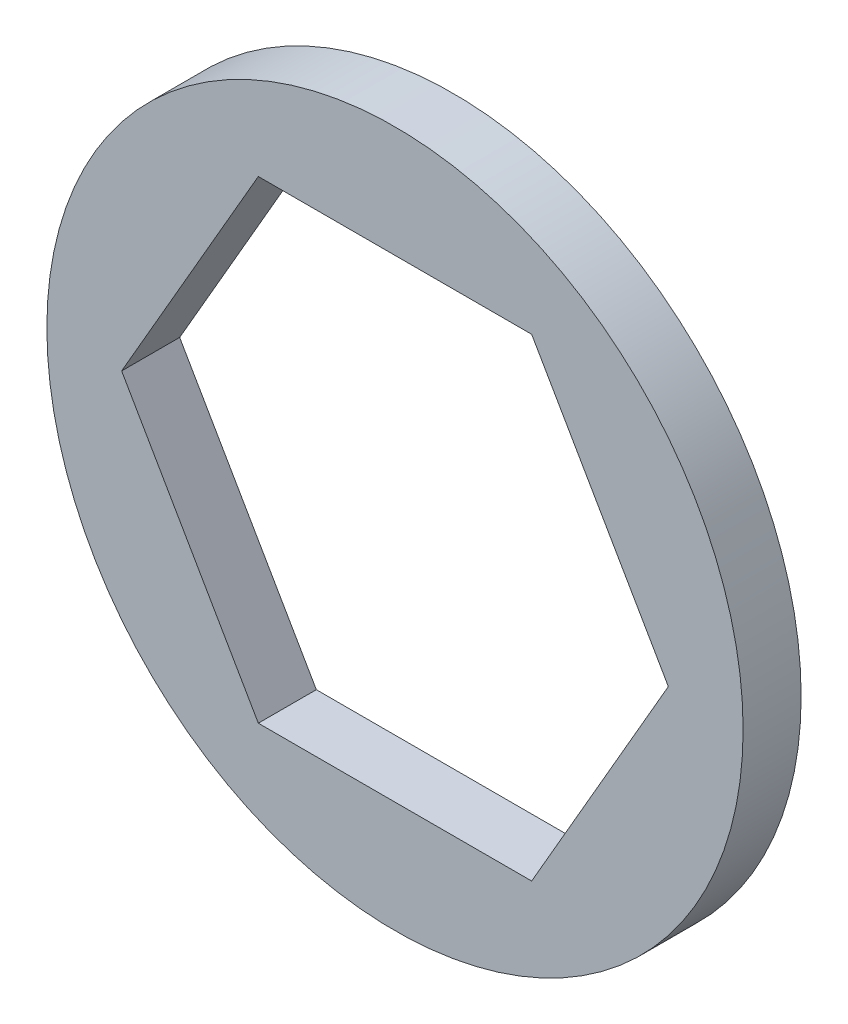
ISO-10303-21;
HEADER;
FILE_DESCRIPTION(('STEP AP214'),'2;1');
FILE_NAME('part.step','',(''),(''),'','','');
FILE_SCHEMA(('AUTOMOTIVE_DESIGN { 1 0 10303 214 1 1 1 1 }'));
ENDSEC;
DATA;
#1=APPLICATION_CONTEXT('core data for automotive mechanical design processes');
#2=APPLICATION_PROTOCOL_DEFINITION('international standard','automotive_design',2000,#1);
#3=PRODUCT_CONTEXT('',#1,'mechanical');
#4=PRODUCT('Part','Part','',(#3));
#5=PRODUCT_RELATED_PRODUCT_CATEGORY('part','',(#4));
#6=PRODUCT_DEFINITION_FORMATION('','',#4);
#7=PRODUCT_DEFINITION_CONTEXT('part definition',#1,'design');
#8=PRODUCT_DEFINITION('design','',#6,#7);
#9=PRODUCT_DEFINITION_SHAPE('','',#8);
#10=(LENGTH_UNIT() NAMED_UNIT(*) SI_UNIT(.MILLI.,.METRE.));
#11=(NAMED_UNIT(*) PLANE_ANGLE_UNIT() SI_UNIT($,.RADIAN.));
#12=(NAMED_UNIT(*) SI_UNIT($,.STERADIAN.) SOLID_ANGLE_UNIT());
#13=UNCERTAINTY_MEASURE_WITH_UNIT(LENGTH_MEASURE(1.E-05),#10,'distance_accuracy_value','');
#14=(GEOMETRIC_REPRESENTATION_CONTEXT(3) GLOBAL_UNCERTAINTY_ASSIGNED_CONTEXT((#13)) GLOBAL_UNIT_ASSIGNED_CONTEXT((#10,
#11,#12)) REPRESENTATION_CONTEXT('',''));
#15=CARTESIAN_POINT('',(0.,0.,0.));
#16=DIRECTION('',(0.,0.,1.));
#17=DIRECTION('',(1.,0.,0.));
#18=AXIS2_PLACEMENT_3D('',#15,#16,#17);
#19=CARTESIAN_POINT('',(0.,0.,0.79375));
#20=DIRECTION('',(0.,0.,1.));
#21=DIRECTION('',(1.,0.,0.));
#22=AXIS2_PLACEMENT_3D('',#19,#20,#21);
#23=PLANE('',#22);
#24=CARTESIAN_POINT('',(0.,0.,0.79375));
#25=DIRECTION('',(0.,0.,1.));
#26=DIRECTION('',(1.,0.,0.));
#27=AXIS2_PLACEMENT_3D('',#24,#25,#26);
#28=CIRCLE('',#27,9.525);
#29=CARTESIAN_POINT('',(9.525,0.,0.79375));
#30=VERTEX_POINT('',#29);
#31=EDGE_CURVE('E11',#30,#30,#28,.T.);
#32=ORIENTED_EDGE('',*,*,#31,.T.);
#33=EDGE_LOOP('',(#32));
#34=FACE_BOUND('',#33,.T.);
#35=DIRECTION('',(-0.5,0.866025403784438,0.));
#36=VECTOR('',#35,1.);
#37=CARTESIAN_POINT('',(7.47899538708241,0.,0.79375));
#38=LINE('',#37,#36);
#39=CARTESIAN_POINT('',(7.47899538708241,0.,0.79375));
#40=VERTEX_POINT('',#39);
#41=CARTESIAN_POINT('',(3.7394976935412,6.477,0.79375));
#42=VERTEX_POINT('',#41);
#43=EDGE_CURVE('E108',#40,#42,#38,.T.);
#44=ORIENTED_EDGE('',*,*,#43,.F.);
#45=DIRECTION('',(0.5,0.866025403784439,0.));
#46=VECTOR('',#45,1.);
#47=CARTESIAN_POINT('',(3.73949769354121,-6.477,0.79375));
#48=LINE('',#47,#46);
#49=CARTESIAN_POINT('',(3.73949769354121,-6.477,0.79375));
#50=VERTEX_POINT('',#49);
#51=EDGE_CURVE('E99',#50,#40,#48,.T.);
#52=ORIENTED_EDGE('',*,*,#51,.F.);
#53=DIRECTION('',(1.,0.,0.));
#54=VECTOR('',#53,1.);
#55=CARTESIAN_POINT('',(-3.73949769354121,-6.477,0.79375));
#56=LINE('',#55,#54);
#57=CARTESIAN_POINT('',(-3.73949769354121,-6.477,0.79375));
#58=VERTEX_POINT('',#57);
#59=EDGE_CURVE('E133',#58,#50,#56,.T.);
#60=ORIENTED_EDGE('',*,*,#59,.F.);
#61=DIRECTION('',(0.5,-0.866025403784438,0.));
#62=VECTOR('',#61,1.);
#63=CARTESIAN_POINT('',(-7.47899538708241,0.,0.79375));
#64=LINE('',#63,#62);
#65=CARTESIAN_POINT('',(-7.47899538708241,0.,0.79375));
#66=VERTEX_POINT('',#65);
#67=EDGE_CURVE('E130',#66,#58,#64,.T.);
#68=ORIENTED_EDGE('',*,*,#67,.F.);
#69=DIRECTION('',(-0.5,-0.866025403784439,0.));
#70=VECTOR('',#69,1.);
#71=CARTESIAN_POINT('',(-3.73949769354121,6.477,0.79375));
#72=LINE('',#71,#70);
#73=CARTESIAN_POINT('',(-3.73949769354121,6.477,0.79375));
#74=VERTEX_POINT('',#73);
#75=EDGE_CURVE('E125',#74,#66,#72,.T.);
#76=ORIENTED_EDGE('',*,*,#75,.F.);
#77=DIRECTION('',(-1.,0.,0.));
#78=VECTOR('',#77,1.);
#79=CARTESIAN_POINT('',(3.7394976935412,6.477,0.79375));
#80=LINE('',#79,#78);
#81=EDGE_CURVE('E121',#42,#74,#80,.T.);
#82=ORIENTED_EDGE('',*,*,#81,.F.);
#83=EDGE_LOOP('',(#44,#52,#60,#68,#76,#82));
#84=FACE_BOUND('',#83,.T.);
#85=ADVANCED_FACE('F45',(#34,#84),#23,.T.);
#86=CARTESIAN_POINT('',(0.,0.,-0.79375));
#87=DIRECTION('',(0.,0.,1.));
#88=DIRECTION('',(1.,0.,0.));
#89=AXIS2_PLACEMENT_3D('',#86,#87,#88);
#90=PLANE('',#89);
#91=CARTESIAN_POINT('',(0.,0.,-0.79375));
#92=DIRECTION('',(0.,0.,1.));
#93=DIRECTION('',(1.,0.,0.));
#94=AXIS2_PLACEMENT_3D('',#91,#92,#93);
#95=CIRCLE('',#94,9.525);
#96=CARTESIAN_POINT('',(9.525,0.,-0.79375));
#97=VERTEX_POINT('',#96);
#98=EDGE_CURVE('E49',#97,#97,#95,.T.);
#99=ORIENTED_EDGE('',*,*,#98,.F.);
#100=EDGE_LOOP('',(#99));
#101=FACE_BOUND('',#100,.T.);
#102=DIRECTION('',(0.5,0.866025403784439,0.));
#103=VECTOR('',#102,1.);
#104=CARTESIAN_POINT('',(3.73949769354121,-6.477,-0.79375));
#105=LINE('',#104,#103);
#106=CARTESIAN_POINT('',(3.73949769354121,-6.477,-0.79375));
#107=VERTEX_POINT('',#106);
#108=CARTESIAN_POINT('',(7.47899538708241,0.,-0.79375));
#109=VERTEX_POINT('',#108);
#110=EDGE_CURVE('E69',#107,#109,#105,.T.);
#111=ORIENTED_EDGE('',*,*,#110,.T.);
#112=DIRECTION('',(-0.5,0.866025403784438,0.));
#113=VECTOR('',#112,1.);
#114=CARTESIAN_POINT('',(7.47899538708241,0.,-0.79375));
#115=LINE('',#114,#113);
#116=CARTESIAN_POINT('',(3.7394976935412,6.477,-0.79375));
#117=VERTEX_POINT('',#116);
#118=EDGE_CURVE('E115',#109,#117,#115,.T.);
#119=ORIENTED_EDGE('',*,*,#118,.T.);
#120=DIRECTION('',(-1.,0.,0.));
#121=VECTOR('',#120,1.);
#122=CARTESIAN_POINT('',(3.7394976935412,6.477,-0.79375));
#123=LINE('',#122,#121);
#124=CARTESIAN_POINT('',(-3.73949769354121,6.477,-0.79375));
#125=VERTEX_POINT('',#124);
#126=EDGE_CURVE('E140',#117,#125,#123,.T.);
#127=ORIENTED_EDGE('',*,*,#126,.T.);
#128=DIRECTION('',(-0.5,-0.866025403784439,0.));
#129=VECTOR('',#128,1.);
#130=CARTESIAN_POINT('',(-3.73949769354121,6.477,-0.79375));
#131=LINE('',#130,#129);
#132=CARTESIAN_POINT('',(-7.47899538708241,0.,-0.79375));
#133=VERTEX_POINT('',#132);
#134=EDGE_CURVE('E144',#125,#133,#131,.T.);
#135=ORIENTED_EDGE('',*,*,#134,.T.);
#136=DIRECTION('',(0.5,-0.866025403784438,0.));
#137=VECTOR('',#136,1.);
#138=CARTESIAN_POINT('',(-7.47899538708241,0.,-0.79375));
#139=LINE('',#138,#137);
#140=CARTESIAN_POINT('',(-3.73949769354121,-6.477,-0.79375));
#141=VERTEX_POINT('',#140);
#142=EDGE_CURVE('E148',#133,#141,#139,.T.);
#143=ORIENTED_EDGE('',*,*,#142,.T.);
#144=DIRECTION('',(1.,0.,0.));
#145=VECTOR('',#144,1.);
#146=CARTESIAN_POINT('',(-3.73949769354121,-6.477,-0.79375));
#147=LINE('',#146,#145);
#148=EDGE_CURVE('E109',#141,#107,#147,.T.);
#149=ORIENTED_EDGE('',*,*,#148,.T.);
#150=EDGE_LOOP('',(#111,#119,#127,#135,#143,#149));
#151=FACE_BOUND('',#150,.T.);
#152=ADVANCED_FACE('F172',(#101,#151),#90,.F.);
#153=CARTESIAN_POINT('',(0.,0.,0.79375));
#154=DIRECTION('',(0.,0.,-1.));
#155=DIRECTION('',(-1.,0.,0.));
#156=AXIS2_PLACEMENT_3D('',#153,#154,#155);
#157=CYLINDRICAL_SURFACE('',#156,9.525);
#158=ORIENTED_EDGE('',*,*,#31,.F.);
#159=EDGE_LOOP('',(#158));
#160=FACE_BOUND('',#159,.T.);
#161=ORIENTED_EDGE('',*,*,#98,.T.);
#162=EDGE_LOOP('',(#161));
#163=FACE_BOUND('',#162,.T.);
#164=ADVANCED_FACE('F47',(#160,#163),#157,.T.);
#165=CARTESIAN_POINT('',(3.73949769354121,-6.477,0.79375));
#166=DIRECTION('',(-0.866025403784439,0.5,0.));
#167=DIRECTION('',(-0.5,-0.866025403784439,0.));
#168=AXIS2_PLACEMENT_3D('',#165,#166,#167);
#169=PLANE('',#168);
#170=ORIENTED_EDGE('',*,*,#110,.F.);
#171=DIRECTION('',(0.,0.,-1.));
#172=VECTOR('',#171,1.);
#173=CARTESIAN_POINT('',(3.73949769354121,-6.477,0.79375));
#174=LINE('',#173,#172);
#175=EDGE_CURVE('E103',#50,#107,#174,.T.);
#176=ORIENTED_EDGE('',*,*,#175,.F.);
#177=ORIENTED_EDGE('',*,*,#51,.T.);
#178=DIRECTION('',(0.,0.,-1.));
#179=VECTOR('',#178,1.);
#180=CARTESIAN_POINT('',(7.47899538708241,0.,0.79375));
#181=LINE('',#180,#179);
#182=EDGE_CURVE('E102',#40,#109,#181,.T.);
#183=ORIENTED_EDGE('',*,*,#182,.T.);
#184=EDGE_LOOP('',(#170,#176,#177,#183));
#185=FACE_BOUND('',#184,.T.);
#186=ADVANCED_FACE('F101',(#185),#169,.T.);
#187=CARTESIAN_POINT('',(7.47899538708241,0.,0.79375));
#188=DIRECTION('',(-0.866025403784439,-0.5,0.));
#189=DIRECTION('',(0.5,-0.866025403784439,0.));
#190=AXIS2_PLACEMENT_3D('',#187,#188,#189);
#191=PLANE('',#190);
#192=ORIENTED_EDGE('',*,*,#118,.F.);
#193=ORIENTED_EDGE('',*,*,#182,.F.);
#194=ORIENTED_EDGE('',*,*,#43,.T.);
#195=DIRECTION('',(0.,0.,-1.));
#196=VECTOR('',#195,1.);
#197=CARTESIAN_POINT('',(3.7394976935412,6.477,0.79375));
#198=LINE('',#197,#196);
#199=EDGE_CURVE('E117',#42,#117,#198,.T.);
#200=ORIENTED_EDGE('',*,*,#199,.T.);
#201=EDGE_LOOP('',(#192,#193,#194,#200));
#202=FACE_BOUND('',#201,.T.);
#203=ADVANCED_FACE('F112',(#202),#191,.T.);
#204=CARTESIAN_POINT('',(3.7394976935412,6.477,0.79375));
#205=DIRECTION('',(0.,-1.,0.));
#206=DIRECTION('',(0.,0.,-1.));
#207=AXIS2_PLACEMENT_3D('',#204,#205,#206);
#208=PLANE('',#207);
#209=ORIENTED_EDGE('',*,*,#126,.F.);
#210=ORIENTED_EDGE('',*,*,#199,.F.);
#211=ORIENTED_EDGE('',*,*,#81,.T.);
#212=DIRECTION('',(0.,0.,-1.));
#213=VECTOR('',#212,1.);
#214=CARTESIAN_POINT('',(-3.73949769354121,6.477,0.79375));
#215=LINE('',#214,#213);
#216=EDGE_CURVE('E162',#74,#125,#215,.T.);
#217=ORIENTED_EDGE('',*,*,#216,.T.);
#218=EDGE_LOOP('',(#209,#210,#211,#217));
#219=FACE_BOUND('',#218,.T.);
#220=ADVANCED_FACE('F168',(#219),#208,.T.);
#221=CARTESIAN_POINT('',(-3.73949769354121,6.477,0.79375));
#222=DIRECTION('',(0.866025403784439,-0.5,0.));
#223=DIRECTION('',(0.5,0.866025403784439,0.));
#224=AXIS2_PLACEMENT_3D('',#221,#222,#223);
#225=PLANE('',#224);
#226=ORIENTED_EDGE('',*,*,#134,.F.);
#227=ORIENTED_EDGE('',*,*,#216,.F.);
#228=ORIENTED_EDGE('',*,*,#75,.T.);
#229=DIRECTION('',(0.,0.,-1.));
#230=VECTOR('',#229,1.);
#231=CARTESIAN_POINT('',(-7.47899538708241,0.,0.79375));
#232=LINE('',#231,#230);
#233=EDGE_CURVE('E159',#66,#133,#232,.T.);
#234=ORIENTED_EDGE('',*,*,#233,.T.);
#235=EDGE_LOOP('',(#226,#227,#228,#234));
#236=FACE_BOUND('',#235,.T.);
#237=ADVANCED_FACE('F180',(#236),#225,.T.);
#238=CARTESIAN_POINT('',(-7.47899538708241,0.,0.79375));
#239=DIRECTION('',(0.866025403784438,0.5,0.));
#240=DIRECTION('',(-0.5,0.866025403784439,0.));
#241=AXIS2_PLACEMENT_3D('',#238,#239,#240);
#242=PLANE('',#241);
#243=ORIENTED_EDGE('',*,*,#142,.F.);
#244=ORIENTED_EDGE('',*,*,#233,.F.);
#245=ORIENTED_EDGE('',*,*,#67,.T.);
#246=DIRECTION('',(0.,0.,-1.));
#247=VECTOR('',#246,1.);
#248=CARTESIAN_POINT('',(-3.73949769354121,-6.477,0.79375));
#249=LINE('',#248,#247);
#250=EDGE_CURVE('E61',#58,#141,#249,.T.);
#251=ORIENTED_EDGE('',*,*,#250,.T.);
#252=EDGE_LOOP('',(#243,#244,#245,#251));
#253=FACE_BOUND('',#252,.T.);
#254=ADVANCED_FACE('F178',(#253),#242,.T.);
#255=CARTESIAN_POINT('',(-3.73949769354121,-6.477,0.79375));
#256=DIRECTION('',(0.,1.,0.));
#257=DIRECTION('',(-1.,0.,0.));
#258=AXIS2_PLACEMENT_3D('',#255,#256,#257);
#259=PLANE('',#258);
#260=ORIENTED_EDGE('',*,*,#148,.F.);
#261=ORIENTED_EDGE('',*,*,#250,.F.);
#262=ORIENTED_EDGE('',*,*,#59,.T.);
#263=ORIENTED_EDGE('',*,*,#175,.T.);
#264=EDGE_LOOP('',(#260,#261,#262,#263));
#265=FACE_BOUND('',#264,.T.);
#266=ADVANCED_FACE('F174',(#265),#259,.T.);
#267=CLOSED_SHELL('',(#85,#152,#164,#186,#203,#220,#237,#254,#266));
#268=MANIFOLD_SOLID_BREP('B2',#267);
#269=ADVANCED_BREP_SHAPE_REPRESENTATION('',(#18,#268),#14);
#270=SHAPE_DEFINITION_REPRESENTATION(#9,#269);
ENDSEC;
END-ISO-10303-21;
